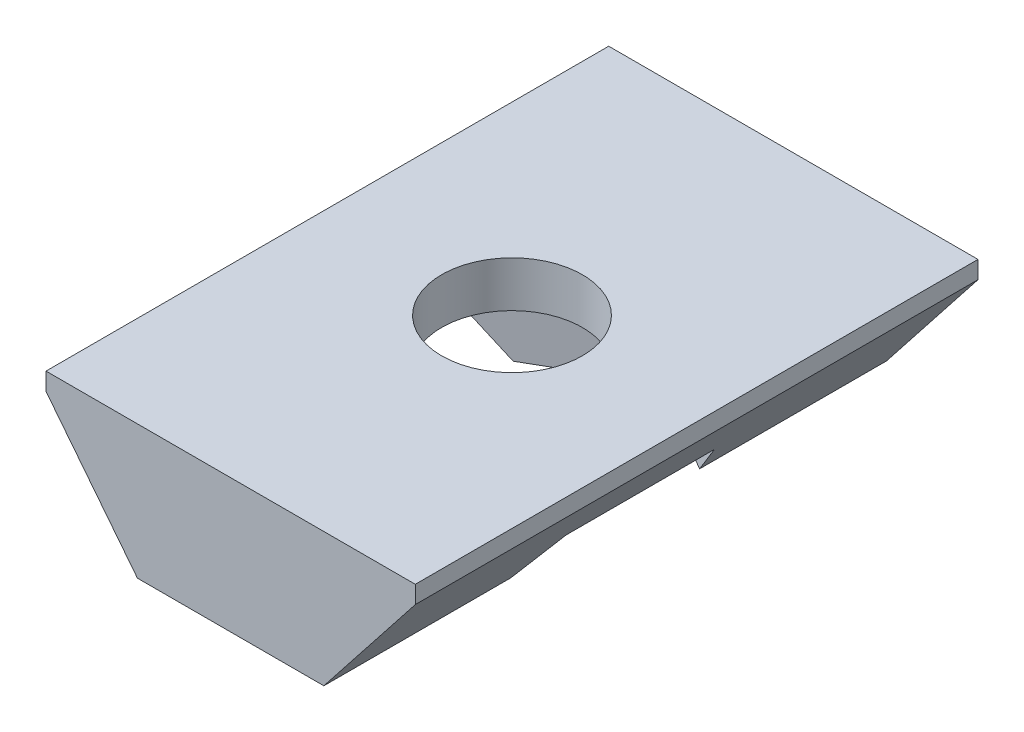
ISO-10303-21;
HEADER;
FILE_DESCRIPTION(('STEP AP214'),'2;1');
FILE_NAME('part.step','',(''),(''),'','','');
FILE_SCHEMA(('AUTOMOTIVE_DESIGN { 1 0 10303 214 1 1 1 1 }'));
ENDSEC;
DATA;
#1=APPLICATION_CONTEXT('core data for automotive mechanical design processes');
#2=APPLICATION_PROTOCOL_DEFINITION('international standard','automotive_design',2000,#1);
#3=PRODUCT_CONTEXT('',#1,'mechanical');
#4=PRODUCT('Part','Part','',(#3));
#5=PRODUCT_RELATED_PRODUCT_CATEGORY('part','',(#4));
#6=PRODUCT_DEFINITION_FORMATION('','',#4);
#7=PRODUCT_DEFINITION_CONTEXT('part definition',#1,'design');
#8=PRODUCT_DEFINITION('design','',#6,#7);
#9=PRODUCT_DEFINITION_SHAPE('','',#8);
#10=(LENGTH_UNIT() NAMED_UNIT(*) SI_UNIT(.MILLI.,.METRE.));
#11=(NAMED_UNIT(*) PLANE_ANGLE_UNIT() SI_UNIT($,.RADIAN.));
#12=(NAMED_UNIT(*) SI_UNIT($,.STERADIAN.) SOLID_ANGLE_UNIT());
#13=UNCERTAINTY_MEASURE_WITH_UNIT(LENGTH_MEASURE(1.E-05),#10,'distance_accuracy_value','');
#14=(GEOMETRIC_REPRESENTATION_CONTEXT(3) GLOBAL_UNCERTAINTY_ASSIGNED_CONTEXT((#13)) GLOBAL_UNIT_ASSIGNED_CONTEXT((#10,
#11,#12)) REPRESENTATION_CONTEXT('',''));
#15=CARTESIAN_POINT('',(0.,0.,0.));
#16=DIRECTION('',(0.,0.,1.));
#17=DIRECTION('',(1.,0.,0.));
#18=AXIS2_PLACEMENT_3D('',#15,#16,#17);
#19=CARTESIAN_POINT('',(-2.65,0.,16.));
#20=DIRECTION('',(0.,1.,0.));
#21=DIRECTION('',(-1.,0.,0.));
#22=AXIS2_PLACEMENT_3D('',#19,#20,#21);
#23=PLANE('',#22);
#24=DIRECTION('',(0.,0.,-1.));
#25=VECTOR('',#24,1.);
#26=CARTESIAN_POINT('',(2.65,0.,16.));
#27=LINE('',#26,#25);
#28=CARTESIAN_POINT('',(2.65,0.,5.31532124826824));
#29=VERTEX_POINT('',#28);
#30=CARTESIAN_POINT('',(2.65,0.,0.));
#31=VERTEX_POINT('',#30);
#32=EDGE_CURVE('E149',#29,#31,#27,.T.);
#33=ORIENTED_EDGE('',*,*,#32,.F.);
#34=DIRECTION('',(0.866025403784438,0.,0.5));
#35=VECTOR('',#34,1.);
#36=CARTESIAN_POINT('',(0.,0.,3.78534303491573));
#37=LINE('',#36,#35);
#38=CARTESIAN_POINT('',(0.,0.,3.78534303491573));
#39=VERTEX_POINT('',#38);
#40=EDGE_CURVE('E50',#39,#29,#37,.T.);
#41=ORIENTED_EDGE('',*,*,#40,.F.);
#42=DIRECTION('',(0.866025403784439,0.,-0.5));
#43=VECTOR('',#42,1.);
#44=CARTESIAN_POINT('',(-3.65,0.,5.89267151745786));
#45=LINE('',#44,#43);
#46=CARTESIAN_POINT('',(-2.65,0.,5.31532124826824));
#47=VERTEX_POINT('',#46);
#48=EDGE_CURVE('E197',#47,#39,#45,.T.);
#49=ORIENTED_EDGE('',*,*,#48,.F.);
#50=DIRECTION('',(0.,0.,-1.));
#51=VECTOR('',#50,1.);
#52=CARTESIAN_POINT('',(-2.65,0.,16.));
#53=LINE('',#52,#51);
#54=CARTESIAN_POINT('',(-2.65,0.,0.));
#55=VERTEX_POINT('',#54);
#56=EDGE_CURVE('E153',#47,#55,#53,.T.);
#57=ORIENTED_EDGE('',*,*,#56,.T.);
#58=DIRECTION('',(1.,0.,0.));
#59=VECTOR('',#58,1.);
#60=CARTESIAN_POINT('',(-2.65,0.,0.));
#61=LINE('',#60,#59);
#62=EDGE_CURVE('E135',#55,#31,#61,.T.);
#63=ORIENTED_EDGE('',*,*,#62,.T.);
#64=EDGE_LOOP('',(#33,#41,#49,#57,#63));
#65=FACE_BOUND('',#64,.T.);
#66=ADVANCED_FACE('F35',(#65),#23,.F.);
#67=CARTESIAN_POINT('',(0.,0.,8.));
#68=DIRECTION('',(0.,1.,0.));
#69=DIRECTION('',(0.,0.,1.));
#70=AXIS2_PLACEMENT_3D('',#67,#68,#69);
#71=CYLINDRICAL_SURFACE('',#70,2.);
#72=CARTESIAN_POINT('',(0.,3.8,8.));
#73=DIRECTION('',(0.,-1.,0.));
#74=DIRECTION('',(0.,0.,-1.));
#75=AXIS2_PLACEMENT_3D('',#72,#73,#74);
#76=CIRCLE('',#75,2.);
#77=CARTESIAN_POINT('',(0.,3.8,10.));
#78=VERTEX_POINT('',#77);
#79=EDGE_CURVE('E136',#78,#78,#76,.T.);
#80=CARTESIAN_POINT('',(0.,2.5,8.));
#81=DIRECTION('',(0.,-1.,0.));
#82=DIRECTION('',(1.,0.,0.));
#83=AXIS2_PLACEMENT_3D('',#80,#81,#82);
#84=CIRCLE('',#83,2.);
#85=CARTESIAN_POINT('',(0.,2.5,10.));
#86=VERTEX_POINT('',#85);
#87=EDGE_CURVE('E160',#86,#86,#84,.F.);
#88=CARTESIAN_POINT('',(0.,3.8,10.));
#89=CARTESIAN_POINT('',(0.,3.78645833333333,10.));
#90=CARTESIAN_POINT('',(0.,3.77291666666667,10.));
#91=CARTESIAN_POINT('',(0.,3.74583333333333,10.));
#92=CARTESIAN_POINT('',(0.,3.73229166666667,10.));
#93=CARTESIAN_POINT('',(0.,3.70520833333333,10.));
#94=CARTESIAN_POINT('',(0.,3.69166666666667,10.));
#95=CARTESIAN_POINT('',(0.,3.66458333333333,10.));
#96=CARTESIAN_POINT('',(0.,3.65104166666667,10.));
#97=CARTESIAN_POINT('',(0.,3.62395833333333,10.));
#98=CARTESIAN_POINT('',(0.,3.61041666666667,10.));
#99=CARTESIAN_POINT('',(0.,3.58333333333333,10.));
#100=CARTESIAN_POINT('',(0.,3.56979166666667,10.));
#101=CARTESIAN_POINT('',(0.,3.54270833333333,10.));
#102=CARTESIAN_POINT('',(0.,3.52916666666667,10.));
#103=CARTESIAN_POINT('',(0.,3.50208333333333,10.));
#104=CARTESIAN_POINT('',(0.,3.48854166666667,10.));
#105=CARTESIAN_POINT('',(0.,3.46145833333333,10.));
#106=CARTESIAN_POINT('',(0.,3.44791666666667,10.));
#107=CARTESIAN_POINT('',(0.,3.42083333333333,10.));
#108=CARTESIAN_POINT('',(0.,3.40729166666667,10.));
#109=CARTESIAN_POINT('',(0.,3.38020833333333,10.));
#110=CARTESIAN_POINT('',(0.,3.36666666666667,10.));
#111=CARTESIAN_POINT('',(0.,3.33958333333333,10.));
#112=CARTESIAN_POINT('',(0.,3.32604166666667,10.));
#113=CARTESIAN_POINT('',(0.,3.29895833333333,10.));
#114=CARTESIAN_POINT('',(0.,3.28541666666667,10.));
#115=CARTESIAN_POINT('',(0.,3.25833333333333,10.));
#116=CARTESIAN_POINT('',(0.,3.24479166666667,10.));
#117=CARTESIAN_POINT('',(0.,3.21770833333333,10.));
#118=CARTESIAN_POINT('',(0.,3.20416666666667,10.));
#119=CARTESIAN_POINT('',(0.,3.17708333333333,10.));
#120=CARTESIAN_POINT('',(0.,3.16354166666667,10.));
#121=CARTESIAN_POINT('',(0.,3.13645833333333,10.));
#122=CARTESIAN_POINT('',(0.,3.12291666666667,10.));
#123=CARTESIAN_POINT('',(0.,3.09583333333333,10.));
#124=CARTESIAN_POINT('',(0.,3.08229166666667,10.));
#125=CARTESIAN_POINT('',(0.,3.05520833333333,10.));
#126=CARTESIAN_POINT('',(0.,3.04166666666667,10.));
#127=CARTESIAN_POINT('',(0.,3.01458333333333,10.));
#128=CARTESIAN_POINT('',(0.,3.00104166666667,10.));
#129=CARTESIAN_POINT('',(0.,2.97395833333333,10.));
#130=CARTESIAN_POINT('',(0.,2.96041666666667,10.));
#131=CARTESIAN_POINT('',(0.,2.93333333333333,10.));
#132=CARTESIAN_POINT('',(0.,2.91979166666667,10.));
#133=CARTESIAN_POINT('',(0.,2.89270833333333,10.));
#134=CARTESIAN_POINT('',(0.,2.87916666666667,10.));
#135=CARTESIAN_POINT('',(0.,2.85208333333333,10.));
#136=CARTESIAN_POINT('',(0.,2.83854166666667,10.));
#137=CARTESIAN_POINT('',(0.,2.81145833333333,10.));
#138=CARTESIAN_POINT('',(0.,2.79791666666667,10.));
#139=CARTESIAN_POINT('',(0.,2.77083333333333,10.));
#140=CARTESIAN_POINT('',(0.,2.75729166666667,10.));
#141=CARTESIAN_POINT('',(0.,2.73020833333333,10.));
#142=CARTESIAN_POINT('',(0.,2.71666666666667,10.));
#143=CARTESIAN_POINT('',(0.,2.68958333333333,10.));
#144=CARTESIAN_POINT('',(0.,2.67604166666667,10.));
#145=CARTESIAN_POINT('',(0.,2.64895833333333,10.));
#146=CARTESIAN_POINT('',(0.,2.63541666666667,10.));
#147=CARTESIAN_POINT('',(0.,2.60833333333333,10.));
#148=CARTESIAN_POINT('',(0.,2.59479166666667,10.));
#149=CARTESIAN_POINT('',(0.,2.56770833333333,10.));
#150=CARTESIAN_POINT('',(0.,2.55416666666667,10.));
#151=CARTESIAN_POINT('',(0.,2.52708333333333,10.));
#152=CARTESIAN_POINT('',(0.,2.51354166666667,10.));
#153=CARTESIAN_POINT('',(0.,2.5,10.));
#154=B_SPLINE_CURVE_WITH_KNOTS('',3,(#88,#89,#90,#91,#92,#93,#94,#95,#96,#97,#98,#99,#100,#101,
#102,#103,#104,#105,#106,#107,#108,#109,#110,#111,#112,#113,#114,#115,#116,#117,#118,#119,#120,
#121,#122,#123,#124,#125,#126,#127,#128,#129,#130,#131,#132,#133,#134,#135,#136,#137,#138,#139,
#140,#141,#142,#143,#144,#145,#146,#147,#148,#149,#150,#151,#152,#153),.UNSPECIFIED.,.F.,.F.,(4,
2,2,2,2,2,2,2,2,2,2,2,2,2,2,2,2,2,2,2,2,2,2,2,2,2,2,2,2,2,2,2,4),(0.,0.0406249999999999,
0.0812500000000002,0.121875,0.1625,0.203125,0.24375,0.284375,0.325,0.365625,0.40625,0.446875,
0.4875,0.528125,0.56875,0.609375,0.65,0.690625,0.73125,0.771875,0.8125,0.853125,0.89375,
0.934375,0.975,1.015625,1.05625,1.096875,1.1375,1.178125,1.21875,1.259375,1.3),.UNSPECIFIED.);
#155=EDGE_CURVE('BSEAM304',#78,#86,#154,.T.);
#156=ORIENTED_EDGE('',*,*,#79,.F.);
#157=ORIENTED_EDGE('',*,*,#87,.F.);
#158=ORIENTED_EDGE('',*,*,#155,.T.);
#159=ORIENTED_EDGE('',*,*,#155,.F.);
#160=EDGE_LOOP('',(#156,#158,#157,#159));
#161=FACE_BOUND('',#160,.T.);
#162=ADVANCED_FACE('F304',(#161),#71,.F.);
#163=CARTESIAN_POINT('',(-2.65,0.,16.));
#164=DIRECTION('',(0.785491672227536,0.618872226603513,0.));
#165=DIRECTION('',(-0.618872226603513,0.785491672227536,0.));
#166=AXIS2_PLACEMENT_3D('',#163,#164,#165);
#167=PLANE('',#166);
#168=ORIENTED_EDGE('',*,*,#56,.F.);
#169=DIRECTION('',(-0.582787783907528,0.739692187267247,0.336472683919436));
#170=VECTOR('',#169,1.);
#171=CARTESIAN_POINT('',(-4.74518184011597,2.65926925860874,6.52497504766041));
#172=LINE('',#171,#170);
#173=CARTESIAN_POINT('',(-3.65,1.26923076923077,5.89267151745786));
#174=VERTEX_POINT('',#173);
#175=EDGE_CURVE('E159',#47,#174,#172,.T.);
#176=ORIENTED_EDGE('',*,*,#175,.T.);
#177=DIRECTION('',(0.,0.,1.));
#178=VECTOR('',#177,1.);
#179=CARTESIAN_POINT('',(-3.65,1.26923076923077,16.));
#180=LINE('',#179,#178);
#181=CARTESIAN_POINT('',(-3.65,1.26923076923077,10.1073284825421));
#182=VERTEX_POINT('',#181);
#183=EDGE_CURVE('E11',#174,#182,#180,.T.);
#184=ORIENTED_EDGE('',*,*,#183,.T.);
#185=DIRECTION('',(0.582787783907528,-0.739692187267247,0.336472683919437));
#186=VECTOR('',#185,1.);
#187=CARTESIAN_POINT('',(-1.60770712320675,-1.32291018977605,11.2864468247228));
#188=LINE('',#187,#186);
#189=CARTESIAN_POINT('',(-2.65,0.,10.6846787517318));
#190=VERTEX_POINT('',#189);
#191=EDGE_CURVE('E163',#182,#190,#188,.T.);
#192=ORIENTED_EDGE('',*,*,#191,.T.);
#193=CARTESIAN_POINT('',(-2.65,0.,16.));
#194=VERTEX_POINT('',#193);
#195=EDGE_CURVE('E154',#194,#190,#53,.T.);
#196=ORIENTED_EDGE('',*,*,#195,.F.);
#197=DIRECTION('',(0.618872226603513,-0.785491672227536,0.));
#198=VECTOR('',#197,1.);
#199=CARTESIAN_POINT('',(-2.65,0.,16.));
#200=LINE('',#199,#198);
#201=CARTESIAN_POINT('',(-5.25,3.3,16.));
#202=VERTEX_POINT('',#201);
#203=EDGE_CURVE('E145',#202,#194,#200,.T.);
#204=ORIENTED_EDGE('',*,*,#203,.F.);
#205=DIRECTION('',(0.,0.,-1.));
#206=VECTOR('',#205,1.);
#207=CARTESIAN_POINT('',(-5.25,3.3,16.));
#208=LINE('',#207,#206);
#209=CARTESIAN_POINT('',(-5.25,3.3,0.));
#210=VERTEX_POINT('',#209);
#211=EDGE_CURVE('E128',#202,#210,#208,.T.);
#212=ORIENTED_EDGE('',*,*,#211,.T.);
#213=DIRECTION('',(0.618872226603513,-0.785491672227536,0.));
#214=VECTOR('',#213,1.);
#215=CARTESIAN_POINT('',(-2.65,0.,0.));
#216=LINE('',#215,#214);
#217=EDGE_CURVE('E132',#210,#55,#216,.T.);
#218=ORIENTED_EDGE('',*,*,#217,.T.);
#219=EDGE_LOOP('',(#168,#176,#184,#192,#196,#204,#212,#218));
#220=FACE_BOUND('',#219,.T.);
#221=ADVANCED_FACE('F37',(#220),#167,.F.);
#222=DIRECTION('',(-0.866025403784438,0.,-0.5));
#223=VECTOR('',#222,1.);
#224=CARTESIAN_POINT('',(0.,0.,12.2146569650843));
#225=LINE('',#224,#223);
#226=CARTESIAN_POINT('',(0.,0.,12.2146569650843));
#227=VERTEX_POINT('',#226);
#228=EDGE_CURVE('E195',#227,#190,#225,.T.);
#229=ORIENTED_EDGE('',*,*,#228,.F.);
#230=DIRECTION('',(-0.866025403784439,0.,0.5));
#231=VECTOR('',#230,1.);
#232=CARTESIAN_POINT('',(3.65,0.,10.1073284825421));
#233=LINE('',#232,#231);
#234=CARTESIAN_POINT('',(2.65,0.,10.6846787517318));
#235=VERTEX_POINT('',#234);
#236=EDGE_CURVE('E185',#235,#227,#233,.T.);
#237=ORIENTED_EDGE('',*,*,#236,.F.);
#238=CARTESIAN_POINT('',(2.65,0.,16.));
#239=VERTEX_POINT('',#238);
#240=EDGE_CURVE('E150',#239,#235,#27,.T.);
#241=ORIENTED_EDGE('',*,*,#240,.F.);
#242=DIRECTION('',(1.,0.,0.));
#243=VECTOR('',#242,1.);
#244=CARTESIAN_POINT('',(-2.65,0.,16.));
#245=LINE('',#244,#243);
#246=EDGE_CURVE('E95',#194,#239,#245,.T.);
#247=ORIENTED_EDGE('',*,*,#246,.F.);
#248=ORIENTED_EDGE('',*,*,#195,.T.);
#249=EDGE_LOOP('',(#229,#237,#241,#247,#248));
#250=FACE_BOUND('',#249,.T.);
#251=ADVANCED_FACE('F193',(#250),#23,.F.);
#252=CARTESIAN_POINT('',(5.25,3.3,16.));
#253=DIRECTION('',(-0.785491672227536,0.618872226603513,0.));
#254=DIRECTION('',(-0.618872226603513,-0.785491672227535,0.));
#255=AXIS2_PLACEMENT_3D('',#252,#253,#254);
#256=PLANE('',#255);
#257=ORIENTED_EDGE('',*,*,#240,.T.);
#258=DIRECTION('',(0.582787783907528,0.739692187267247,-0.336472683919437));
#259=VECTOR('',#258,1.);
#260=CARTESIAN_POINT('',(3.91335106894448,1.60348404904492,9.95528267199566));
#261=LINE('',#260,#259);
#262=CARTESIAN_POINT('',(3.65,1.26923076923077,10.1073284825421));
#263=VERTEX_POINT('',#262);
#264=EDGE_CURVE('E43',#235,#263,#261,.T.);
#265=ORIENTED_EDGE('',*,*,#264,.T.);
#266=DIRECTION('',(0.,0.,-1.));
#267=VECTOR('',#266,1.);
#268=CARTESIAN_POINT('',(3.65,1.26923076923077,16.));
#269=LINE('',#268,#267);
#270=CARTESIAN_POINT('',(3.65,1.26923076923077,5.89267151745787));
#271=VERTEX_POINT('',#270);
#272=EDGE_CURVE('E166',#263,#271,#269,.T.);
#273=ORIENTED_EDGE('',*,*,#272,.T.);
#274=DIRECTION('',(-0.582787783907528,-0.739692187267247,-0.336472683919437));
#275=VECTOR('',#274,1.);
#276=CARTESIAN_POINT('',(7.05082578585371,5.58566349742971,7.85613920038753));
#277=LINE('',#276,#275);
#278=EDGE_CURVE('E156',#271,#29,#277,.T.);
#279=ORIENTED_EDGE('',*,*,#278,.T.);
#280=ORIENTED_EDGE('',*,*,#32,.T.);
#281=DIRECTION('',(0.618872226603513,0.785491672227535,0.));
#282=VECTOR('',#281,1.);
#283=CARTESIAN_POINT('',(5.25,3.3,0.));
#284=LINE('',#283,#282);
#285=CARTESIAN_POINT('',(5.25,3.3,0.));
#286=VERTEX_POINT('',#285);
#287=EDGE_CURVE('E139',#31,#286,#284,.T.);
#288=ORIENTED_EDGE('',*,*,#287,.T.);
#289=DIRECTION('',(0.,0.,-1.));
#290=VECTOR('',#289,1.);
#291=CARTESIAN_POINT('',(5.25,3.3,16.));
#292=LINE('',#291,#290);
#293=CARTESIAN_POINT('',(5.25,3.3,16.));
#294=VERTEX_POINT('',#293);
#295=EDGE_CURVE('E123',#294,#286,#292,.T.);
#296=ORIENTED_EDGE('',*,*,#295,.F.);
#297=DIRECTION('',(0.618872226603513,0.785491672227535,0.));
#298=VECTOR('',#297,1.);
#299=CARTESIAN_POINT('',(5.25,3.3,16.));
#300=LINE('',#299,#298);
#301=EDGE_CURVE('E111',#239,#294,#300,.T.);
#302=ORIENTED_EDGE('',*,*,#301,.F.);
#303=EDGE_LOOP('',(#257,#265,#273,#279,#280,#288,#296,#302));
#304=FACE_BOUND('',#303,.T.);
#305=ADVANCED_FACE('F172',(#304),#256,.F.);
#306=CARTESIAN_POINT('',(5.25,3.3,16.));
#307=DIRECTION('',(-1.,0.,0.));
#308=DIRECTION('',(0.,-1.,0.));
#309=AXIS2_PLACEMENT_3D('',#306,#307,#308);
#310=PLANE('',#309);
#311=DIRECTION('',(0.,1.,0.));
#312=VECTOR('',#311,1.);
#313=CARTESIAN_POINT('',(5.25,3.3,0.));
#314=LINE('',#313,#312);
#315=CARTESIAN_POINT('',(5.25,3.8,0.));
#316=VERTEX_POINT('',#315);
#317=EDGE_CURVE('E120',#286,#316,#314,.T.);
#318=ORIENTED_EDGE('',*,*,#317,.T.);
#319=DIRECTION('',(0.,0.,-1.));
#320=VECTOR('',#319,1.);
#321=CARTESIAN_POINT('',(5.25,3.8,16.));
#322=LINE('',#321,#320);
#323=CARTESIAN_POINT('',(5.25,3.8,16.));
#324=VERTEX_POINT('',#323);
#325=EDGE_CURVE('E117',#324,#316,#322,.T.);
#326=ORIENTED_EDGE('',*,*,#325,.F.);
#327=DIRECTION('',(0.,1.,0.));
#328=VECTOR('',#327,1.);
#329=CARTESIAN_POINT('',(5.25,3.3,16.));
#330=LINE('',#329,#328);
#331=EDGE_CURVE('E104',#294,#324,#330,.T.);
#332=ORIENTED_EDGE('',*,*,#331,.F.);
#333=ORIENTED_EDGE('',*,*,#295,.T.);
#334=EDGE_LOOP('',(#318,#326,#332,#333));
#335=FACE_BOUND('',#334,.T.);
#336=ADVANCED_FACE('F118',(#335),#310,.F.);
#337=CARTESIAN_POINT('',(-5.25,3.8,16.));
#338=DIRECTION('',(0.,-1.,0.));
#339=DIRECTION('',(0.,0.,-1.));
#340=AXIS2_PLACEMENT_3D('',#337,#338,#339);
#341=PLANE('',#340);
#342=ORIENTED_EDGE('',*,*,#79,.T.);
#343=EDGE_LOOP('',(#342));
#344=FACE_BOUND('',#343,.T.);
#345=DIRECTION('',(-1.,0.,0.));
#346=VECTOR('',#345,1.);
#347=CARTESIAN_POINT('',(-5.25,3.8,0.));
#348=LINE('',#347,#346);
#349=CARTESIAN_POINT('',(-5.25,3.8,0.));
#350=VERTEX_POINT('',#349);
#351=EDGE_CURVE('E142',#316,#350,#348,.T.);
#352=ORIENTED_EDGE('',*,*,#351,.T.);
#353=DIRECTION('',(0.,0.,-1.));
#354=VECTOR('',#353,1.);
#355=CARTESIAN_POINT('',(-5.25,3.8,16.));
#356=LINE('',#355,#354);
#357=CARTESIAN_POINT('',(-5.25,3.8,16.));
#358=VERTEX_POINT('',#357);
#359=EDGE_CURVE('E124',#358,#350,#356,.T.);
#360=ORIENTED_EDGE('',*,*,#359,.F.);
#361=DIRECTION('',(-1.,0.,0.));
#362=VECTOR('',#361,1.);
#363=CARTESIAN_POINT('',(-5.25,3.8,16.));
#364=LINE('',#363,#362);
#365=EDGE_CURVE('E108',#324,#358,#364,.T.);
#366=ORIENTED_EDGE('',*,*,#365,.F.);
#367=ORIENTED_EDGE('',*,*,#325,.T.);
#368=EDGE_LOOP('',(#352,#360,#366,#367));
#369=FACE_BOUND('',#368,.T.);
#370=ADVANCED_FACE('F126',(#344,#369),#341,.F.);
#371=CARTESIAN_POINT('',(-5.25,3.3,16.));
#372=DIRECTION('',(1.,0.,0.));
#373=DIRECTION('',(0.,1.,0.));
#374=AXIS2_PLACEMENT_3D('',#371,#372,#373);
#375=PLANE('',#374);
#376=DIRECTION('',(0.,-1.,0.));
#377=VECTOR('',#376,1.);
#378=CARTESIAN_POINT('',(-5.25,3.3,0.));
#379=LINE('',#378,#377);
#380=EDGE_CURVE('E86',#350,#210,#379,.T.);
#381=ORIENTED_EDGE('',*,*,#380,.T.);
#382=ORIENTED_EDGE('',*,*,#211,.F.);
#383=DIRECTION('',(0.,-1.,0.));
#384=VECTOR('',#383,1.);
#385=CARTESIAN_POINT('',(-5.25,3.3,16.));
#386=LINE('',#385,#384);
#387=EDGE_CURVE('E59',#358,#202,#386,.T.);
#388=ORIENTED_EDGE('',*,*,#387,.F.);
#389=ORIENTED_EDGE('',*,*,#359,.T.);
#390=EDGE_LOOP('',(#381,#382,#388,#389));
#391=FACE_BOUND('',#390,.T.);
#392=ADVANCED_FACE('F337',(#391),#375,.F.);
#393=CARTESIAN_POINT('',(0.,0.,16.));
#394=DIRECTION('',(0.,0.,1.));
#395=DIRECTION('',(1.,0.,0.));
#396=AXIS2_PLACEMENT_3D('',#393,#394,#395);
#397=PLANE('',#396);
#398=ORIENTED_EDGE('',*,*,#203,.T.);
#399=ORIENTED_EDGE('',*,*,#246,.T.);
#400=ORIENTED_EDGE('',*,*,#301,.T.);
#401=ORIENTED_EDGE('',*,*,#331,.T.);
#402=ORIENTED_EDGE('',*,*,#365,.T.);
#403=ORIENTED_EDGE('',*,*,#387,.T.);
#404=EDGE_LOOP('',(#398,#399,#400,#401,#402,#403));
#405=FACE_BOUND('',#404,.T.);
#406=ADVANCED_FACE('F106',(#405),#397,.T.);
#407=CARTESIAN_POINT('',(0.,0.,0.));
#408=DIRECTION('',(0.,0.,1.));
#409=DIRECTION('',(1.,0.,0.));
#410=AXIS2_PLACEMENT_3D('',#407,#408,#409);
#411=PLANE('',#410);
#412=ORIENTED_EDGE('',*,*,#217,.F.);
#413=ORIENTED_EDGE('',*,*,#380,.F.);
#414=ORIENTED_EDGE('',*,*,#351,.F.);
#415=ORIENTED_EDGE('',*,*,#317,.F.);
#416=ORIENTED_EDGE('',*,*,#287,.F.);
#417=ORIENTED_EDGE('',*,*,#62,.F.);
#418=EDGE_LOOP('',(#412,#413,#414,#415,#416,#417));
#419=FACE_BOUND('',#418,.T.);
#420=ADVANCED_FACE('F259',(#419),#411,.F.);
#421=CARTESIAN_POINT('',(-3.65,2.5,10.1073284825421));
#422=DIRECTION('',(-1.,0.,0.));
#423=DIRECTION('',(0.,0.,1.));
#424=AXIS2_PLACEMENT_3D('',#421,#422,#423);
#425=PLANE('',#424);
#426=DIRECTION('',(0.,-1.,0.));
#427=VECTOR('',#426,1.);
#428=CARTESIAN_POINT('',(-3.65,2.5,5.89267151745786));
#429=LINE('',#428,#427);
#430=CARTESIAN_POINT('',(-3.65,2.5,5.89267151745786));
#431=VERTEX_POINT('',#430);
#432=EDGE_CURVE('E213',#431,#174,#429,.T.);
#433=ORIENTED_EDGE('',*,*,#432,.F.);
#434=DIRECTION('',(0.,0.,-1.));
#435=VECTOR('',#434,1.);
#436=CARTESIAN_POINT('',(-3.65,2.5,10.1073284825421));
#437=LINE('',#436,#435);
#438=CARTESIAN_POINT('',(-3.65,2.5,10.1073284825421));
#439=VERTEX_POINT('',#438);
#440=EDGE_CURVE('E278',#439,#431,#437,.T.);
#441=ORIENTED_EDGE('',*,*,#440,.F.);
#442=DIRECTION('',(0.,-1.,0.));
#443=VECTOR('',#442,1.);
#444=CARTESIAN_POINT('',(-3.65,2.5,10.1073284825421));
#445=LINE('',#444,#443);
#446=EDGE_CURVE('E216',#439,#182,#445,.T.);
#447=ORIENTED_EDGE('',*,*,#446,.T.);
#448=ORIENTED_EDGE('',*,*,#183,.F.);
#449=EDGE_LOOP('',(#433,#441,#447,#448));
#450=FACE_BOUND('',#449,.T.);
#451=ADVANCED_FACE('F242',(#450),#425,.F.);
#452=CARTESIAN_POINT('',(-3.65,2.5,5.89267151745786));
#453=DIRECTION('',(-0.5,0.,-0.866025403784439));
#454=DIRECTION('',(-0.866025403784439,0.,0.5));
#455=AXIS2_PLACEMENT_3D('',#452,#453,#454);
#456=PLANE('',#455);
#457=ORIENTED_EDGE('',*,*,#48,.T.);
#458=DIRECTION('',(0.,-1.,0.));
#459=VECTOR('',#458,1.);
#460=CARTESIAN_POINT('',(0.,2.5,3.78534303491573));
#461=LINE('',#460,#459);
#462=CARTESIAN_POINT('',(0.,2.5,3.78534303491573));
#463=VERTEX_POINT('',#462);
#464=EDGE_CURVE('E211',#463,#39,#461,.T.);
#465=ORIENTED_EDGE('',*,*,#464,.F.);
#466=DIRECTION('',(0.866025403784439,0.,-0.5));
#467=VECTOR('',#466,1.);
#468=CARTESIAN_POINT('',(-3.65,2.5,5.89267151745786));
#469=LINE('',#468,#467);
#470=EDGE_CURVE('E251',#431,#463,#469,.T.);
#471=ORIENTED_EDGE('',*,*,#470,.F.);
#472=ORIENTED_EDGE('',*,*,#432,.T.);
#473=ORIENTED_EDGE('',*,*,#175,.F.);
#474=EDGE_LOOP('',(#457,#465,#471,#472,#473));
#475=FACE_BOUND('',#474,.T.);
#476=ADVANCED_FACE('F247',(#475),#456,.F.);
#477=CARTESIAN_POINT('',(0.,2.5,12.2146569650843));
#478=DIRECTION('',(-0.5,0.,0.866025403784438));
#479=DIRECTION('',(0.866025403784438,0.,0.5));
#480=AXIS2_PLACEMENT_3D('',#477,#478,#479);
#481=PLANE('',#480);
#482=ORIENTED_EDGE('',*,*,#446,.F.);
#483=DIRECTION('',(-0.866025403784438,0.,-0.5));
#484=VECTOR('',#483,1.);
#485=CARTESIAN_POINT('',(0.,2.5,12.2146569650843));
#486=LINE('',#485,#484);
#487=CARTESIAN_POINT('',(0.,2.5,12.2146569650843));
#488=VERTEX_POINT('',#487);
#489=EDGE_CURVE('E276',#488,#439,#486,.T.);
#490=ORIENTED_EDGE('',*,*,#489,.F.);
#491=DIRECTION('',(0.,-1.,0.));
#492=VECTOR('',#491,1.);
#493=CARTESIAN_POINT('',(0.,2.5,12.2146569650843));
#494=LINE('',#493,#492);
#495=EDGE_CURVE('E219',#488,#227,#494,.T.);
#496=ORIENTED_EDGE('',*,*,#495,.T.);
#497=ORIENTED_EDGE('',*,*,#228,.T.);
#498=ORIENTED_EDGE('',*,*,#191,.F.);
#499=EDGE_LOOP('',(#482,#490,#496,#497,#498));
#500=FACE_BOUND('',#499,.T.);
#501=ADVANCED_FACE('F274',(#500),#481,.F.);
#502=CARTESIAN_POINT('',(3.65,2.5,10.1073284825421));
#503=DIRECTION('',(0.5,0.,0.866025403784439));
#504=DIRECTION('',(0.866025403784439,0.,-0.5));
#505=AXIS2_PLACEMENT_3D('',#502,#503,#504);
#506=PLANE('',#505);
#507=ORIENTED_EDGE('',*,*,#236,.T.);
#508=ORIENTED_EDGE('',*,*,#495,.F.);
#509=DIRECTION('',(-0.866025403784439,0.,0.5));
#510=VECTOR('',#509,1.);
#511=CARTESIAN_POINT('',(3.65,2.5,10.1073284825421));
#512=LINE('',#511,#510);
#513=CARTESIAN_POINT('',(3.65,2.5,10.1073284825421));
#514=VERTEX_POINT('',#513);
#515=EDGE_CURVE('E206',#514,#488,#512,.T.);
#516=ORIENTED_EDGE('',*,*,#515,.F.);
#517=DIRECTION('',(0.,-1.,0.));
#518=VECTOR('',#517,1.);
#519=CARTESIAN_POINT('',(3.65,2.5,10.1073284825421));
#520=LINE('',#519,#518);
#521=EDGE_CURVE('E164',#514,#263,#520,.T.);
#522=ORIENTED_EDGE('',*,*,#521,.T.);
#523=ORIENTED_EDGE('',*,*,#264,.F.);
#524=EDGE_LOOP('',(#507,#508,#516,#522,#523));
#525=FACE_BOUND('',#524,.T.);
#526=ADVANCED_FACE('F182',(#525),#506,.F.);
#527=CARTESIAN_POINT('',(3.65,2.5,5.89267151745787));
#528=DIRECTION('',(1.,0.,0.));
#529=DIRECTION('',(0.,1.,0.));
#530=AXIS2_PLACEMENT_3D('',#527,#528,#529);
#531=PLANE('',#530);
#532=ORIENTED_EDGE('',*,*,#521,.F.);
#533=DIRECTION('',(0.,0.,1.));
#534=VECTOR('',#533,1.);
#535=CARTESIAN_POINT('',(3.65,2.5,5.89267151745787));
#536=LINE('',#535,#534);
#537=CARTESIAN_POINT('',(3.65,2.5,5.89267151745787));
#538=VERTEX_POINT('',#537);
#539=EDGE_CURVE('E200',#538,#514,#536,.T.);
#540=ORIENTED_EDGE('',*,*,#539,.F.);
#541=DIRECTION('',(0.,-1.,0.));
#542=VECTOR('',#541,1.);
#543=CARTESIAN_POINT('',(3.65,2.5,5.89267151745787));
#544=LINE('',#543,#542);
#545=EDGE_CURVE('E208',#538,#271,#544,.T.);
#546=ORIENTED_EDGE('',*,*,#545,.T.);
#547=ORIENTED_EDGE('',*,*,#272,.F.);
#548=EDGE_LOOP('',(#532,#540,#546,#547));
#549=FACE_BOUND('',#548,.T.);
#550=ADVANCED_FACE('F292',(#549),#531,.F.);
#551=CARTESIAN_POINT('',(0.,2.5,3.78534303491573));
#552=DIRECTION('',(0.5,0.,-0.866025403784438));
#553=DIRECTION('',(-0.866025403784438,0.,-0.5));
#554=AXIS2_PLACEMENT_3D('',#551,#552,#553);
#555=PLANE('',#554);
#556=ORIENTED_EDGE('',*,*,#545,.F.);
#557=DIRECTION('',(0.866025403784438,0.,0.5));
#558=VECTOR('',#557,1.);
#559=CARTESIAN_POINT('',(0.,2.5,3.78534303491573));
#560=LINE('',#559,#558);
#561=EDGE_CURVE('E287',#463,#538,#560,.T.);
#562=ORIENTED_EDGE('',*,*,#561,.F.);
#563=ORIENTED_EDGE('',*,*,#464,.T.);
#564=ORIENTED_EDGE('',*,*,#40,.T.);
#565=ORIENTED_EDGE('',*,*,#278,.F.);
#566=EDGE_LOOP('',(#556,#562,#563,#564,#565));
#567=FACE_BOUND('',#566,.T.);
#568=ADVANCED_FACE('F293',(#567),#555,.F.);
#569=CARTESIAN_POINT('',(0.,2.5,0.));
#570=DIRECTION('',(0.,-1.,0.));
#571=DIRECTION('',(1.,0.,0.));
#572=AXIS2_PLACEMENT_3D('',#569,#570,#571);
#573=PLANE('',#572);
#574=ORIENTED_EDGE('',*,*,#515,.T.);
#575=ORIENTED_EDGE('',*,*,#489,.T.);
#576=ORIENTED_EDGE('',*,*,#440,.T.);
#577=ORIENTED_EDGE('',*,*,#470,.T.);
#578=ORIENTED_EDGE('',*,*,#561,.T.);
#579=ORIENTED_EDGE('',*,*,#539,.T.);
#580=EDGE_LOOP('',(#574,#575,#576,#577,#578,#579));
#581=FACE_BOUND('',#580,.T.);
#582=ORIENTED_EDGE('',*,*,#87,.T.);
#583=EDGE_LOOP('',(#582));
#584=FACE_BOUND('',#583,.T.);
#585=ADVANCED_FACE('F281',(#581,#584),#573,.T.);
#586=CLOSED_SHELL('',(#66,#162,#221,#251,#305,#336,#370,#392,#406,#420,#451,#476,#501,#526,#550,
#568,#585));
#587=MANIFOLD_SOLID_BREP('B2',#586);
#588=ADVANCED_BREP_SHAPE_REPRESENTATION('',(#18,#587),#14);
#589=SHAPE_DEFINITION_REPRESENTATION(#9,#588);
ENDSEC;
END-ISO-10303-21;
